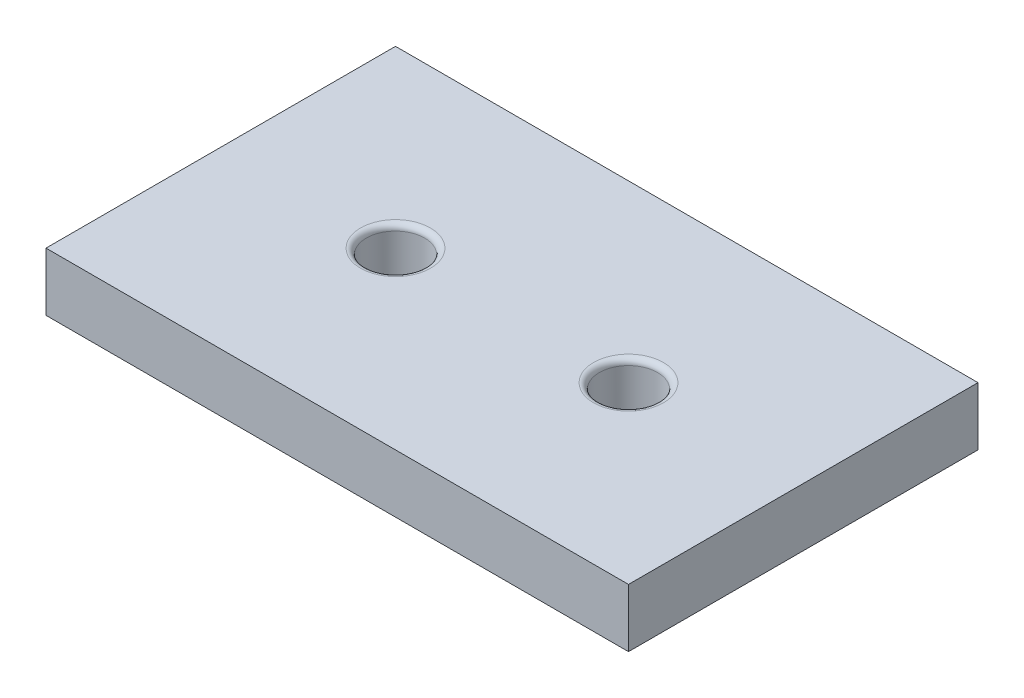
ISO-10303-21;
HEADER;
FILE_DESCRIPTION(('STEP AP214'),'2;1');
FILE_NAME('part.step','',(''),(''),'','','');
FILE_SCHEMA(('AUTOMOTIVE_DESIGN { 1 0 10303 214 1 1 1 1 }'));
ENDSEC;
DATA;
#1=APPLICATION_CONTEXT('core data for automotive mechanical design processes');
#2=APPLICATION_PROTOCOL_DEFINITION('international standard','automotive_design',2000,#1);
#3=PRODUCT_CONTEXT('',#1,'mechanical');
#4=PRODUCT('Part','Part','',(#3));
#5=PRODUCT_RELATED_PRODUCT_CATEGORY('part','',(#4));
#6=PRODUCT_DEFINITION_FORMATION('','',#4);
#7=PRODUCT_DEFINITION_CONTEXT('part definition',#1,'design');
#8=PRODUCT_DEFINITION('design','',#6,#7);
#9=PRODUCT_DEFINITION_SHAPE('','',#8);
#10=(LENGTH_UNIT() NAMED_UNIT(*) SI_UNIT(.MILLI.,.METRE.));
#11=(NAMED_UNIT(*) PLANE_ANGLE_UNIT() SI_UNIT($,.RADIAN.));
#12=(NAMED_UNIT(*) SI_UNIT($,.STERADIAN.) SOLID_ANGLE_UNIT());
#13=UNCERTAINTY_MEASURE_WITH_UNIT(LENGTH_MEASURE(1.E-05),#10,'distance_accuracy_value','');
#14=(GEOMETRIC_REPRESENTATION_CONTEXT(3) GLOBAL_UNCERTAINTY_ASSIGNED_CONTEXT((#13)) GLOBAL_UNIT_ASSIGNED_CONTEXT((#10,
#11,#12)) REPRESENTATION_CONTEXT('',''));
#15=CARTESIAN_POINT('',(0.,0.,0.));
#16=DIRECTION('',(0.,0.,1.));
#17=DIRECTION('',(1.,0.,0.));
#18=AXIS2_PLACEMENT_3D('',#15,#16,#17);
#19=CARTESIAN_POINT('',(50.,10.,30.));
#20=DIRECTION('',(-1.,0.,0.));
#21=DIRECTION('',(0.,0.,1.));
#22=AXIS2_PLACEMENT_3D('',#19,#20,#21);
#23=PLANE('',#22);
#24=DIRECTION('',(0.,0.,-1.));
#25=VECTOR('',#24,1.);
#26=CARTESIAN_POINT('',(50.,0.,30.));
#27=LINE('',#26,#25);
#28=CARTESIAN_POINT('',(50.,0.,30.));
#29=VERTEX_POINT('',#28);
#30=CARTESIAN_POINT('',(50.,0.,-30.));
#31=VERTEX_POINT('',#30);
#32=EDGE_CURVE('E107',#29,#31,#27,.T.);
#33=ORIENTED_EDGE('',*,*,#32,.T.);
#34=DIRECTION('',(0.,-1.,0.));
#35=VECTOR('',#34,1.);
#36=CARTESIAN_POINT('',(50.,10.,-30.));
#37=LINE('',#36,#35);
#38=CARTESIAN_POINT('',(50.,10.,-30.));
#39=VERTEX_POINT('',#38);
#40=EDGE_CURVE('E98',#39,#31,#37,.T.);
#41=ORIENTED_EDGE('',*,*,#40,.F.);
#42=DIRECTION('',(0.,0.,-1.));
#43=VECTOR('',#42,1.);
#44=CARTESIAN_POINT('',(50.,10.,30.));
#45=LINE('',#44,#43);
#46=CARTESIAN_POINT('',(50.,10.,30.));
#47=VERTEX_POINT('',#46);
#48=EDGE_CURVE('E92',#47,#39,#45,.T.);
#49=ORIENTED_EDGE('',*,*,#48,.F.);
#50=DIRECTION('',(0.,-1.,0.));
#51=VECTOR('',#50,1.);
#52=CARTESIAN_POINT('',(50.,10.,30.));
#53=LINE('',#52,#51);
#54=EDGE_CURVE('E103',#47,#29,#53,.T.);
#55=ORIENTED_EDGE('',*,*,#54,.T.);
#56=EDGE_LOOP('',(#33,#41,#49,#55));
#57=FACE_BOUND('',#56,.T.);
#58=ADVANCED_FACE('F39',(#57),#23,.F.);
#59=CARTESIAN_POINT('',(-50.,10.,-30.));
#60=DIRECTION('',(0.,0.,1.));
#61=DIRECTION('',(1.,0.,0.));
#62=AXIS2_PLACEMENT_3D('',#59,#60,#61);
#63=PLANE('',#62);
#64=DIRECTION('',(-1.,0.,0.));
#65=VECTOR('',#64,1.);
#66=CARTESIAN_POINT('',(-50.,0.,-30.));
#67=LINE('',#66,#65);
#68=CARTESIAN_POINT('',(-50.,0.,-30.));
#69=VERTEX_POINT('',#68);
#70=EDGE_CURVE('E97',#31,#69,#67,.T.);
#71=ORIENTED_EDGE('',*,*,#70,.T.);
#72=DIRECTION('',(0.,-1.,0.));
#73=VECTOR('',#72,1.);
#74=CARTESIAN_POINT('',(-50.,10.,-30.));
#75=LINE('',#74,#73);
#76=CARTESIAN_POINT('',(-50.,10.,-30.));
#77=VERTEX_POINT('',#76);
#78=EDGE_CURVE('E95',#77,#69,#75,.T.);
#79=ORIENTED_EDGE('',*,*,#78,.F.);
#80=DIRECTION('',(-1.,0.,0.));
#81=VECTOR('',#80,1.);
#82=CARTESIAN_POINT('',(-50.,10.,-30.));
#83=LINE('',#82,#81);
#84=EDGE_CURVE('E87',#39,#77,#83,.T.);
#85=ORIENTED_EDGE('',*,*,#84,.F.);
#86=ORIENTED_EDGE('',*,*,#40,.T.);
#87=EDGE_LOOP('',(#71,#79,#85,#86));
#88=FACE_BOUND('',#87,.T.);
#89=ADVANCED_FACE('F96',(#88),#63,.F.);
#90=CARTESIAN_POINT('',(-50.,10.,30.));
#91=DIRECTION('',(1.,0.,0.));
#92=DIRECTION('',(0.,0.,-1.));
#93=AXIS2_PLACEMENT_3D('',#90,#91,#92);
#94=PLANE('',#93);
#95=DIRECTION('',(0.,0.,1.));
#96=VECTOR('',#95,1.);
#97=CARTESIAN_POINT('',(-50.,0.,30.));
#98=LINE('',#97,#96);
#99=CARTESIAN_POINT('',(-50.,0.,30.));
#100=VERTEX_POINT('',#99);
#101=EDGE_CURVE('E73',#69,#100,#98,.T.);
#102=ORIENTED_EDGE('',*,*,#101,.T.);
#103=DIRECTION('',(0.,-1.,0.));
#104=VECTOR('',#103,1.);
#105=CARTESIAN_POINT('',(-50.,10.,30.));
#106=LINE('',#105,#104);
#107=CARTESIAN_POINT('',(-50.,10.,30.));
#108=VERTEX_POINT('',#107);
#109=EDGE_CURVE('E99',#108,#100,#106,.T.);
#110=ORIENTED_EDGE('',*,*,#109,.F.);
#111=DIRECTION('',(0.,0.,1.));
#112=VECTOR('',#111,1.);
#113=CARTESIAN_POINT('',(-50.,10.,30.));
#114=LINE('',#113,#112);
#115=EDGE_CURVE('E90',#77,#108,#114,.T.);
#116=ORIENTED_EDGE('',*,*,#115,.F.);
#117=ORIENTED_EDGE('',*,*,#78,.T.);
#118=EDGE_LOOP('',(#102,#110,#116,#117));
#119=FACE_BOUND('',#118,.T.);
#120=ADVANCED_FACE('F101',(#119),#94,.F.);
#121=CARTESIAN_POINT('',(-50.,10.,30.));
#122=DIRECTION('',(0.,0.,-1.));
#123=DIRECTION('',(-1.,0.,0.));
#124=AXIS2_PLACEMENT_3D('',#121,#122,#123);
#125=PLANE('',#124);
#126=DIRECTION('',(1.,0.,0.));
#127=VECTOR('',#126,1.);
#128=CARTESIAN_POINT('',(-50.,0.,30.));
#129=LINE('',#128,#127);
#130=EDGE_CURVE('E79',#100,#29,#129,.T.);
#131=ORIENTED_EDGE('',*,*,#130,.T.);
#132=ORIENTED_EDGE('',*,*,#54,.F.);
#133=DIRECTION('',(1.,0.,0.));
#134=VECTOR('',#133,1.);
#135=CARTESIAN_POINT('',(-50.,10.,30.));
#136=LINE('',#135,#134);
#137=EDGE_CURVE('E56',#108,#47,#136,.T.);
#138=ORIENTED_EDGE('',*,*,#137,.F.);
#139=ORIENTED_EDGE('',*,*,#109,.T.);
#140=EDGE_LOOP('',(#131,#132,#138,#139));
#141=FACE_BOUND('',#140,.T.);
#142=ADVANCED_FACE('F167',(#141),#125,.F.);
#143=CARTESIAN_POINT('',(0.,10.,0.));
#144=DIRECTION('',(0.,-1.,0.));
#145=DIRECTION('',(0.,0.,-1.));
#146=AXIS2_PLACEMENT_3D('',#143,#144,#145);
#147=PLANE('',#146);
#148=CARTESIAN_POINT('',(20.,10.,0.));
#149=DIRECTION('',(0.,-1.,0.));
#150=DIRECTION('',(0.,0.,-1.));
#151=AXIS2_PLACEMENT_3D('',#148,#149,#150);
#152=CIRCLE('',#151,6.);
#153=CARTESIAN_POINT('',(20.,10.,-6.));
#154=VERTEX_POINT('',#153);
#155=EDGE_CURVE('E48',#154,#154,#152,.T.);
#156=ORIENTED_EDGE('',*,*,#155,.T.);
#157=EDGE_LOOP('',(#156));
#158=FACE_BOUND('',#157,.T.);
#159=CARTESIAN_POINT('',(-20.,10.,0.));
#160=DIRECTION('',(0.,-1.,0.));
#161=DIRECTION('',(0.,0.,-1.));
#162=AXIS2_PLACEMENT_3D('',#159,#160,#161);
#163=CIRCLE('',#162,6.);
#164=CARTESIAN_POINT('',(-20.,10.,-6.));
#165=VERTEX_POINT('',#164);
#166=EDGE_CURVE('E120',#165,#165,#163,.T.);
#167=ORIENTED_EDGE('',*,*,#166,.T.);
#168=EDGE_LOOP('',(#167));
#169=FACE_BOUND('',#168,.T.);
#170=ORIENTED_EDGE('',*,*,#48,.T.);
#171=ORIENTED_EDGE('',*,*,#84,.T.);
#172=ORIENTED_EDGE('',*,*,#115,.T.);
#173=ORIENTED_EDGE('',*,*,#137,.T.);
#174=EDGE_LOOP('',(#170,#171,#172,#173));
#175=FACE_BOUND('',#174,.T.);
#176=ADVANCED_FACE('F88',(#158,#169,#175),#147,.F.);
#177=CARTESIAN_POINT('',(0.,0.,0.));
#178=DIRECTION('',(0.,-1.,0.));
#179=DIRECTION('',(0.,0.,-1.));
#180=AXIS2_PLACEMENT_3D('',#177,#178,#179);
#181=PLANE('',#180);
#182=CARTESIAN_POINT('',(20.,0.,0.));
#183=DIRECTION('',(0.,1.,0.));
#184=DIRECTION('',(0.,0.,1.));
#185=AXIS2_PLACEMENT_3D('',#182,#183,#184);
#186=CIRCLE('',#185,5.);
#187=CARTESIAN_POINT('',(20.,0.,5.));
#188=VERTEX_POINT('',#187);
#189=EDGE_CURVE('E139',#188,#188,#186,.T.);
#190=ORIENTED_EDGE('',*,*,#189,.T.);
#191=EDGE_LOOP('',(#190));
#192=FACE_BOUND('',#191,.T.);
#193=CARTESIAN_POINT('',(-20.,0.,0.));
#194=DIRECTION('',(0.,1.,0.));
#195=DIRECTION('',(0.,0.,1.));
#196=AXIS2_PLACEMENT_3D('',#193,#194,#195);
#197=CIRCLE('',#196,5.);
#198=CARTESIAN_POINT('',(-20.,0.,5.));
#199=VERTEX_POINT('',#198);
#200=EDGE_CURVE('E110',#199,#199,#197,.T.);
#201=ORIENTED_EDGE('',*,*,#200,.T.);
#202=EDGE_LOOP('',(#201));
#203=FACE_BOUND('',#202,.T.);
#204=ORIENTED_EDGE('',*,*,#32,.F.);
#205=ORIENTED_EDGE('',*,*,#130,.F.);
#206=ORIENTED_EDGE('',*,*,#101,.F.);
#207=ORIENTED_EDGE('',*,*,#70,.F.);
#208=EDGE_LOOP('',(#204,#205,#206,#207));
#209=FACE_BOUND('',#208,.T.);
#210=ADVANCED_FACE('F146',(#192,#203,#209),#181,.T.);
#211=CARTESIAN_POINT('',(-20.,20.,0.));
#212=DIRECTION('',(0.,-1.,0.));
#213=DIRECTION('',(0.,0.,-1.));
#214=AXIS2_PLACEMENT_3D('',#211,#212,#213);
#215=CYLINDRICAL_SURFACE('',#214,5.);
#216=CARTESIAN_POINT('',(-20.,9.,0.));
#217=DIRECTION('',(0.,-1.,0.));
#218=DIRECTION('',(0.,0.,-1.));
#219=AXIS2_PLACEMENT_3D('',#216,#217,#218);
#220=CIRCLE('',#219,5.);
#221=CARTESIAN_POINT('',(-20.,9.,-5.));
#222=VERTEX_POINT('',#221);
#223=EDGE_CURVE('E11',#222,#222,#220,.F.);
#224=ORIENTED_EDGE('',*,*,#223,.T.);
#225=EDGE_LOOP('',(#224));
#226=FACE_BOUND('',#225,.T.);
#227=ORIENTED_EDGE('',*,*,#200,.F.);
#228=EDGE_LOOP('',(#227));
#229=FACE_BOUND('',#228,.T.);
#230=ADVANCED_FACE('F135',(#226,#229),#215,.F.);
#231=CARTESIAN_POINT('',(20.,20.,0.));
#232=DIRECTION('',(0.,-1.,0.));
#233=DIRECTION('',(0.,0.,-1.));
#234=AXIS2_PLACEMENT_3D('',#231,#232,#233);
#235=CYLINDRICAL_SURFACE('',#234,5.);
#236=CARTESIAN_POINT('',(20.,9.,0.));
#237=DIRECTION('',(0.,-1.,0.));
#238=DIRECTION('',(0.,0.,-1.));
#239=AXIS2_PLACEMENT_3D('',#236,#237,#238);
#240=CIRCLE('',#239,5.);
#241=CARTESIAN_POINT('',(20.,9.,-5.));
#242=VERTEX_POINT('',#241);
#243=EDGE_CURVE('E117',#242,#242,#240,.F.);
#244=ORIENTED_EDGE('',*,*,#243,.T.);
#245=EDGE_LOOP('',(#244));
#246=FACE_BOUND('',#245,.T.);
#247=ORIENTED_EDGE('',*,*,#189,.F.);
#248=EDGE_LOOP('',(#247));
#249=FACE_BOUND('',#248,.T.);
#250=ADVANCED_FACE('F130',(#246,#249),#235,.F.);
#251=CARTESIAN_POINT('',(20.,9.,0.));
#252=DIRECTION('',(0.,-1.,0.));
#253=DIRECTION('',(0.,0.,-1.));
#254=AXIS2_PLACEMENT_3D('',#251,#252,#253);
#255=TOROIDAL_SURFACE('',#254,6.,1.);
#256=ORIENTED_EDGE('',*,*,#155,.F.);
#257=EDGE_LOOP('',(#256));
#258=FACE_BOUND('',#257,.T.);
#259=ORIENTED_EDGE('',*,*,#243,.F.);
#260=EDGE_LOOP('',(#259));
#261=FACE_BOUND('',#260,.T.);
#262=ADVANCED_FACE('F127',(#258,#261),#255,.T.);
#263=CARTESIAN_POINT('',(-20.,9.,0.));
#264=DIRECTION('',(0.,-1.,0.));
#265=DIRECTION('',(0.,0.,-1.));
#266=AXIS2_PLACEMENT_3D('',#263,#264,#265);
#267=TOROIDAL_SURFACE('',#266,6.,1.);
#268=ORIENTED_EDGE('',*,*,#166,.F.);
#269=EDGE_LOOP('',(#268));
#270=FACE_BOUND('',#269,.T.);
#271=ORIENTED_EDGE('',*,*,#223,.F.);
#272=EDGE_LOOP('',(#271));
#273=FACE_BOUND('',#272,.T.);
#274=ADVANCED_FACE('F41',(#270,#273),#267,.T.);
#275=CLOSED_SHELL('',(#58,#89,#120,#142,#176,#210,#230,#250,#262,#274));
#276=MANIFOLD_SOLID_BREP('B2',#275);
#277=ADVANCED_BREP_SHAPE_REPRESENTATION('',(#18,#276),#14);
#278=SHAPE_DEFINITION_REPRESENTATION(#9,#277);
ENDSEC;
END-ISO-10303-21;
